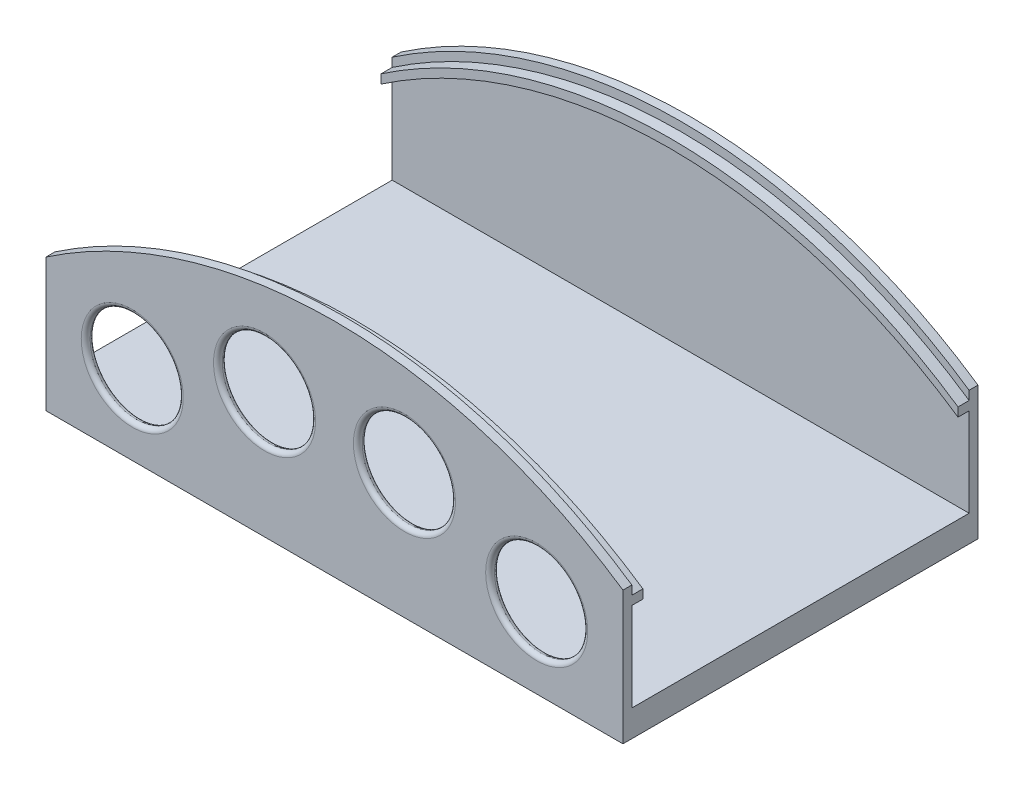
ISO-10303-21;
HEADER;
FILE_DESCRIPTION(('STEP AP214'),'2;1');
FILE_NAME('part.step','',(''),(''),'','','');
FILE_SCHEMA(('AUTOMOTIVE_DESIGN { 1 0 10303 214 1 1 1 1 }'));
ENDSEC;
DATA;
#1=APPLICATION_CONTEXT('core data for automotive mechanical design processes');
#2=APPLICATION_PROTOCOL_DEFINITION('international standard','automotive_design',2000,#1);
#3=PRODUCT_CONTEXT('',#1,'mechanical');
#4=PRODUCT('Part','Part','',(#3));
#5=PRODUCT_RELATED_PRODUCT_CATEGORY('part','',(#4));
#6=PRODUCT_DEFINITION_FORMATION('','',#4);
#7=PRODUCT_DEFINITION_CONTEXT('part definition',#1,'design');
#8=PRODUCT_DEFINITION('design','',#6,#7);
#9=PRODUCT_DEFINITION_SHAPE('','',#8);
#10=(LENGTH_UNIT() NAMED_UNIT(*) SI_UNIT(.MILLI.,.METRE.));
#11=(NAMED_UNIT(*) PLANE_ANGLE_UNIT() SI_UNIT($,.RADIAN.));
#12=(NAMED_UNIT(*) SI_UNIT($,.STERADIAN.) SOLID_ANGLE_UNIT());
#13=UNCERTAINTY_MEASURE_WITH_UNIT(LENGTH_MEASURE(1.E-05),#10,'distance_accuracy_value','');
#14=(GEOMETRIC_REPRESENTATION_CONTEXT(3) GLOBAL_UNCERTAINTY_ASSIGNED_CONTEXT((#13)) GLOBAL_UNIT_ASSIGNED_CONTEXT((#10,
#11,#12)) REPRESENTATION_CONTEXT('',''));
#15=CARTESIAN_POINT('',(0.,0.,0.));
#16=DIRECTION('',(0.,0.,1.));
#17=DIRECTION('',(1.,0.,0.));
#18=AXIS2_PLACEMENT_3D('',#15,#16,#17);
#19=CARTESIAN_POINT('',(0.,6.,2.));
#20=DIRECTION('',(0.,0.,-1.));
#21=DIRECTION('',(-1.,0.,0.));
#22=AXIS2_PLACEMENT_3D('',#19,#20,#21);
#23=PLANE('',#22);
#24=CARTESIAN_POINT('',(65.,-67.6250000000005,2.));
#25=DIRECTION('',(0.,0.,1.));
#26=DIRECTION('',(-1.,0.,0.));
#27=AXIS2_PLACEMENT_3D('',#24,#25,#26);
#28=CIRCLE('',#27,115.625);
#29=CARTESIAN_POINT('',(130.,28.,2.));
#30=VERTEX_POINT('',#29);
#31=CARTESIAN_POINT('',(0.,28.,2.));
#32=VERTEX_POINT('',#31);
#33=EDGE_CURVE('E230',#30,#32,#28,.T.);
#34=ORIENTED_EDGE('',*,*,#33,.F.);
#35=DIRECTION('',(0.,1.,0.));
#36=VECTOR('',#35,1.);
#37=CARTESIAN_POINT('',(130.,6.,2.));
#38=LINE('',#37,#36);
#39=CARTESIAN_POINT('',(130.,30.,2.));
#40=VERTEX_POINT('',#39);
#41=EDGE_CURVE('E382',#30,#40,#38,.T.);
#42=ORIENTED_EDGE('',*,*,#41,.T.);
#43=CARTESIAN_POINT('',(65.,-65.625,2.));
#44=DIRECTION('',(0.,0.,-1.));
#45=DIRECTION('',(-1.,0.,0.));
#46=AXIS2_PLACEMENT_3D('',#43,#44,#45);
#47=CIRCLE('',#46,115.625);
#48=CARTESIAN_POINT('',(0.,30.,2.));
#49=VERTEX_POINT('',#48);
#50=EDGE_CURVE('E436',#49,#40,#47,.T.);
#51=ORIENTED_EDGE('',*,*,#50,.F.);
#52=DIRECTION('',(0.,1.,0.));
#53=VECTOR('',#52,1.);
#54=CARTESIAN_POINT('',(0.,6.,2.));
#55=LINE('',#54,#53);
#56=EDGE_CURVE('E65',#32,#49,#55,.T.);
#57=ORIENTED_EDGE('',*,*,#56,.F.);
#58=EDGE_LOOP('',(#34,#42,#51,#57));
#59=FACE_BOUND('',#58,.T.);
#60=ADVANCED_FACE('F39',(#59),#23,.F.);
#61=CARTESIAN_POINT('',(65.,-69.6250000000005,2.));
#62=DIRECTION('',(0.,0.,-1.));
#63=DIRECTION('',(-1.,0.,0.));
#64=AXIS2_PLACEMENT_3D('',#61,#62,#63);
#65=CIRCLE('',#64,115.625);
#66=CARTESIAN_POINT('',(0.,26.,2.));
#67=VERTEX_POINT('',#66);
#68=CARTESIAN_POINT('',(130.,26.,2.));
#69=VERTEX_POINT('',#68);
#70=EDGE_CURVE('E227',#67,#69,#65,.T.);
#71=ORIENTED_EDGE('',*,*,#70,.F.);
#72=CARTESIAN_POINT('',(0.,6.,2.));
#73=VERTEX_POINT('',#72);
#74=EDGE_CURVE('E370',#73,#67,#55,.T.);
#75=ORIENTED_EDGE('',*,*,#74,.F.);
#76=DIRECTION('',(1.,0.,0.));
#77=VECTOR('',#76,1.);
#78=CARTESIAN_POINT('',(0.,6.,2.));
#79=LINE('',#78,#77);
#80=CARTESIAN_POINT('',(130.,6.,2.));
#81=VERTEX_POINT('',#80);
#82=EDGE_CURVE('E385',#73,#81,#79,.T.);
#83=ORIENTED_EDGE('',*,*,#82,.T.);
#84=EDGE_CURVE('E57',#81,#69,#38,.T.);
#85=ORIENTED_EDGE('',*,*,#84,.T.);
#86=EDGE_LOOP('',(#71,#75,#83,#85));
#87=FACE_BOUND('',#86,.T.);
#88=ADVANCED_FACE('F502',(#87),#23,.F.);
#89=CARTESIAN_POINT('',(0.,6.,78.));
#90=DIRECTION('',(0.,0.,1.));
#91=DIRECTION('',(1.,0.,0.));
#92=AXIS2_PLACEMENT_3D('',#89,#90,#91);
#93=PLANE('',#92);
#94=CARTESIAN_POINT('',(65.,-67.6249999999999,78.));
#95=DIRECTION('',(0.,0.,-1.));
#96=DIRECTION('',(1.,0.,0.));
#97=AXIS2_PLACEMENT_3D('',#94,#95,#96);
#98=CIRCLE('',#97,115.625);
#99=CARTESIAN_POINT('',(0.,28.,78.));
#100=VERTEX_POINT('',#99);
#101=CARTESIAN_POINT('',(130.,28.,78.));
#102=VERTEX_POINT('',#101);
#103=EDGE_CURVE('E232',#100,#102,#98,.T.);
#104=ORIENTED_EDGE('',*,*,#103,.F.);
#105=DIRECTION('',(0.,-1.,0.));
#106=VECTOR('',#105,1.);
#107=CARTESIAN_POINT('',(0.,6.,78.));
#108=LINE('',#107,#106);
#109=CARTESIAN_POINT('',(0.,30.,78.));
#110=VERTEX_POINT('',#109);
#111=EDGE_CURVE('E361',#110,#100,#108,.T.);
#112=ORIENTED_EDGE('',*,*,#111,.F.);
#113=CARTESIAN_POINT('',(65.,-65.625,78.));
#114=DIRECTION('',(0.,0.,1.));
#115=DIRECTION('',(1.,0.,0.));
#116=AXIS2_PLACEMENT_3D('',#113,#114,#115);
#117=CIRCLE('',#116,115.625);
#118=CARTESIAN_POINT('',(130.,30.,78.));
#119=VERTEX_POINT('',#118);
#120=EDGE_CURVE('E440',#119,#110,#117,.T.);
#121=ORIENTED_EDGE('',*,*,#120,.F.);
#122=DIRECTION('',(0.,-1.,0.));
#123=VECTOR('',#122,1.);
#124=CARTESIAN_POINT('',(130.,6.,78.));
#125=LINE('',#124,#123);
#126=EDGE_CURVE('E374',#119,#102,#125,.T.);
#127=ORIENTED_EDGE('',*,*,#126,.T.);
#128=EDGE_LOOP('',(#104,#112,#121,#127));
#129=FACE_BOUND('',#128,.T.);
#130=ADVANCED_FACE('F507',(#129),#93,.F.);
#131=CARTESIAN_POINT('',(19.439269403951,18.,78.));
#132=DIRECTION('',(0.,0.,1.));
#133=DIRECTION('',(1.,0.,0.));
#134=AXIS2_PLACEMENT_3D('',#131,#132,#133);
#135=CIRCLE('',#134,11.5);
#136=CARTESIAN_POINT('',(30.939269403951,18.,78.));
#137=VERTEX_POINT('',#136);
#138=EDGE_CURVE('E460',#137,#137,#135,.T.);
#139=ORIENTED_EDGE('',*,*,#138,.T.);
#140=EDGE_LOOP('',(#139));
#141=FACE_BOUND('',#140,.T.);
#142=CARTESIAN_POINT('',(49.237283636687,28.292291114552,78.));
#143=DIRECTION('',(0.,0.,1.));
#144=DIRECTION('',(1.,0.,0.));
#145=AXIS2_PLACEMENT_3D('',#142,#143,#144);
#146=CIRCLE('',#145,11.5);
#147=CARTESIAN_POINT('',(60.737283636687,28.292291114552,78.));
#148=VERTEX_POINT('',#147);
#149=EDGE_CURVE('E464',#148,#148,#146,.T.);
#150=ORIENTED_EDGE('',*,*,#149,.T.);
#151=EDGE_LOOP('',(#150));
#152=FACE_BOUND('',#151,.T.);
#153=CARTESIAN_POINT('',(80.762716363313,28.292291114552,78.));
#154=DIRECTION('',(0.,0.,1.));
#155=DIRECTION('',(1.,0.,0.));
#156=AXIS2_PLACEMENT_3D('',#153,#154,#155);
#157=CIRCLE('',#156,11.5);
#158=CARTESIAN_POINT('',(92.262716363313,28.292291114552,78.));
#159=VERTEX_POINT('',#158);
#160=EDGE_CURVE('E49',#159,#159,#157,.T.);
#161=ORIENTED_EDGE('',*,*,#160,.T.);
#162=EDGE_LOOP('',(#161));
#163=FACE_BOUND('',#162,.T.);
#164=CARTESIAN_POINT('',(110.560730596049,18.,78.));
#165=DIRECTION('',(0.,0.,1.));
#166=DIRECTION('',(1.,0.,0.));
#167=AXIS2_PLACEMENT_3D('',#164,#165,#166);
#168=CIRCLE('',#167,11.5);
#169=CARTESIAN_POINT('',(122.060730596049,18.,78.));
#170=VERTEX_POINT('',#169);
#171=EDGE_CURVE('E11',#170,#170,#168,.T.);
#172=ORIENTED_EDGE('',*,*,#171,.T.);
#173=EDGE_LOOP('',(#172));
#174=FACE_BOUND('',#173,.T.);
#175=CARTESIAN_POINT('',(65.,-69.625,78.));
#176=DIRECTION('',(0.,0.,1.));
#177=DIRECTION('',(1.,0.,0.));
#178=AXIS2_PLACEMENT_3D('',#175,#176,#177);
#179=CIRCLE('',#178,115.625);
#180=CARTESIAN_POINT('',(130.,26.,78.));
#181=VERTEX_POINT('',#180);
#182=CARTESIAN_POINT('',(0.,26.,78.));
#183=VERTEX_POINT('',#182);
#184=EDGE_CURVE('E237',#181,#183,#179,.T.);
#185=ORIENTED_EDGE('',*,*,#184,.F.);
#186=CARTESIAN_POINT('',(130.,6.,78.));
#187=VERTEX_POINT('',#186);
#188=EDGE_CURVE('E307',#181,#187,#125,.T.);
#189=ORIENTED_EDGE('',*,*,#188,.T.);
#190=DIRECTION('',(1.,0.,0.));
#191=VECTOR('',#190,1.);
#192=CARTESIAN_POINT('',(0.,6.,78.));
#193=LINE('',#192,#191);
#194=CARTESIAN_POINT('',(0.,6.,78.));
#195=VERTEX_POINT('',#194);
#196=EDGE_CURVE('E373',#195,#187,#193,.T.);
#197=ORIENTED_EDGE('',*,*,#196,.F.);
#198=EDGE_CURVE('E366',#183,#195,#108,.T.);
#199=ORIENTED_EDGE('',*,*,#198,.F.);
#200=EDGE_LOOP('',(#185,#189,#197,#199));
#201=FACE_BOUND('',#200,.T.);
#202=ADVANCED_FACE('F519',(#141,#152,#163,#174,#201),#93,.F.);
#203=CARTESIAN_POINT('',(65.,-65.625,80.));
#204=DIRECTION('',(0.,0.,-1.));
#205=DIRECTION('',(-1.,0.,0.));
#206=AXIS2_PLACEMENT_3D('',#203,#204,#205);
#207=CYLINDRICAL_SURFACE('',#206,115.625);
#208=DIRECTION('',(0.,0.,-1.));
#209=VECTOR('',#208,1.);
#210=CARTESIAN_POINT('',(130.,30.,80.));
#211=LINE('',#210,#209);
#212=CARTESIAN_POINT('',(130.,30.,80.));
#213=VERTEX_POINT('',#212);
#214=EDGE_CURVE('E424',#213,#119,#211,.T.);
#215=ORIENTED_EDGE('',*,*,#214,.T.);
#216=ORIENTED_EDGE('',*,*,#120,.T.);
#217=DIRECTION('',(0.,0.,-1.));
#218=VECTOR('',#217,1.);
#219=CARTESIAN_POINT('',(0.,30.,80.));
#220=LINE('',#219,#218);
#221=CARTESIAN_POINT('',(0.,30.,80.));
#222=VERTEX_POINT('',#221);
#223=EDGE_CURVE('E420',#222,#110,#220,.T.);
#224=ORIENTED_EDGE('',*,*,#223,.F.);
#225=CARTESIAN_POINT('',(65.,-65.625,80.));
#226=DIRECTION('',(0.,0.,1.));
#227=DIRECTION('',(-1.,0.,0.));
#228=AXIS2_PLACEMENT_3D('',#225,#226,#227);
#229=CIRCLE('',#228,115.625);
#230=EDGE_CURVE('E403',#213,#222,#229,.T.);
#231=ORIENTED_EDGE('',*,*,#230,.F.);
#232=EDGE_LOOP('',(#215,#216,#224,#231));
#233=FACE_BOUND('',#232,.T.);
#234=ADVANCED_FACE('F533',(#233),#207,.T.);
#235=CARTESIAN_POINT('',(0.,0.,80.));
#236=DIRECTION('',(1.,0.,0.));
#237=DIRECTION('',(0.,0.,-1.));
#238=AXIS2_PLACEMENT_3D('',#235,#236,#237);
#239=PLANE('',#238);
#240=ORIENTED_EDGE('',*,*,#223,.T.);
#241=ORIENTED_EDGE('',*,*,#111,.T.);
#242=DIRECTION('',(0.,0.,1.));
#243=VECTOR('',#242,1.);
#244=CARTESIAN_POINT('',(0.,28.,75.5));
#245=LINE('',#244,#243);
#246=CARTESIAN_POINT('',(0.,28.,75.5));
#247=VERTEX_POINT('',#246);
#248=EDGE_CURVE('E255',#247,#100,#245,.T.);
#249=ORIENTED_EDGE('',*,*,#248,.F.);
#250=DIRECTION('',(0.,1.,0.));
#251=VECTOR('',#250,1.);
#252=CARTESIAN_POINT('',(0.,26.,75.5));
#253=LINE('',#252,#251);
#254=CARTESIAN_POINT('',(0.,26.,75.5));
#255=VERTEX_POINT('',#254);
#256=EDGE_CURVE('E253',#255,#247,#253,.T.);
#257=ORIENTED_EDGE('',*,*,#256,.F.);
#258=DIRECTION('',(0.,0.,1.));
#259=VECTOR('',#258,1.);
#260=CARTESIAN_POINT('',(0.,26.,75.5));
#261=LINE('',#260,#259);
#262=EDGE_CURVE('E262',#255,#183,#261,.T.);
#263=ORIENTED_EDGE('',*,*,#262,.T.);
#264=ORIENTED_EDGE('',*,*,#198,.T.);
#265=DIRECTION('',(0.,0.,-1.));
#266=VECTOR('',#265,1.);
#267=CARTESIAN_POINT('',(0.,6.,78.));
#268=LINE('',#267,#266);
#269=EDGE_CURVE('E365',#195,#73,#268,.T.);
#270=ORIENTED_EDGE('',*,*,#269,.T.);
#271=ORIENTED_EDGE('',*,*,#74,.T.);
#272=DIRECTION('',(0.,0.,-1.));
#273=VECTOR('',#272,1.);
#274=CARTESIAN_POINT('',(0.,26.,4.5));
#275=LINE('',#274,#273);
#276=CARTESIAN_POINT('',(0.,26.,4.5));
#277=VERTEX_POINT('',#276);
#278=EDGE_CURVE('E212',#277,#67,#275,.T.);
#279=ORIENTED_EDGE('',*,*,#278,.F.);
#280=DIRECTION('',(0.,-1.,0.));
#281=VECTOR('',#280,1.);
#282=CARTESIAN_POINT('',(0.,26.,4.5));
#283=LINE('',#282,#281);
#284=CARTESIAN_POINT('',(0.,28.,4.5));
#285=VERTEX_POINT('',#284);
#286=EDGE_CURVE('E203',#285,#277,#283,.T.);
#287=ORIENTED_EDGE('',*,*,#286,.F.);
#288=DIRECTION('',(0.,0.,-1.));
#289=VECTOR('',#288,1.);
#290=CARTESIAN_POINT('',(0.,28.,4.5));
#291=LINE('',#290,#289);
#292=EDGE_CURVE('E208',#285,#32,#291,.T.);
#293=ORIENTED_EDGE('',*,*,#292,.T.);
#294=ORIENTED_EDGE('',*,*,#56,.T.);
#295=CARTESIAN_POINT('',(0.,30.,0.));
#296=VERTEX_POINT('',#295);
#297=EDGE_CURVE('E406',#49,#296,#220,.T.);
#298=ORIENTED_EDGE('',*,*,#297,.T.);
#299=DIRECTION('',(0.,-1.,0.));
#300=VECTOR('',#299,1.);
#301=CARTESIAN_POINT('',(0.,0.,0.));
#302=LINE('',#301,#300);
#303=CARTESIAN_POINT('',(0.,0.,0.));
#304=VERTEX_POINT('',#303);
#305=EDGE_CURVE('E388',#296,#304,#302,.T.);
#306=ORIENTED_EDGE('',*,*,#305,.T.);
#307=DIRECTION('',(0.,0.,-1.));
#308=VECTOR('',#307,1.);
#309=CARTESIAN_POINT('',(0.,0.,80.));
#310=LINE('',#309,#308);
#311=CARTESIAN_POINT('',(0.,0.,80.));
#312=VERTEX_POINT('',#311);
#313=EDGE_CURVE('E432',#312,#304,#310,.T.);
#314=ORIENTED_EDGE('',*,*,#313,.F.);
#315=DIRECTION('',(0.,-1.,0.));
#316=VECTOR('',#315,1.);
#317=CARTESIAN_POINT('',(0.,0.,80.));
#318=LINE('',#317,#316);
#319=EDGE_CURVE('E392',#222,#312,#318,.T.);
#320=ORIENTED_EDGE('',*,*,#319,.F.);
#321=EDGE_LOOP('',(#240,#241,#249,#257,#263,#264,#270,#271,#279,#287,#293,#294,#298,#306,#314,#320));
#322=FACE_BOUND('',#321,.T.);
#323=ADVANCED_FACE('F206',(#322),#239,.F.);
#324=CARTESIAN_POINT('',(0.,0.,80.));
#325=DIRECTION('',(0.,1.,0.));
#326=DIRECTION('',(0.,0.,1.));
#327=AXIS2_PLACEMENT_3D('',#324,#325,#326);
#328=PLANE('',#327);
#329=DIRECTION('',(1.,0.,0.));
#330=VECTOR('',#329,1.);
#331=CARTESIAN_POINT('',(15.,0.,14.));
#332=LINE('',#331,#330);
#333=CARTESIAN_POINT('',(15.,0.,14.));
#334=VERTEX_POINT('',#333);
#335=CARTESIAN_POINT('',(22.,0.,14.));
#336=VERTEX_POINT('',#335);
#337=EDGE_CURVE('E292',#334,#336,#332,.T.);
#338=ORIENTED_EDGE('',*,*,#337,.F.);
#339=DIRECTION('',(0.,0.,-1.));
#340=VECTOR('',#339,1.);
#341=CARTESIAN_POINT('',(15.,0.,66.));
#342=LINE('',#341,#340);
#343=CARTESIAN_POINT('',(15.,0.,66.));
#344=VERTEX_POINT('',#343);
#345=EDGE_CURVE('E289',#344,#334,#342,.T.);
#346=ORIENTED_EDGE('',*,*,#345,.F.);
#347=DIRECTION('',(-1.,0.,0.));
#348=VECTOR('',#347,1.);
#349=CARTESIAN_POINT('',(15.,0.,66.));
#350=LINE('',#349,#348);
#351=CARTESIAN_POINT('',(22.,0.,66.));
#352=VERTEX_POINT('',#351);
#353=EDGE_CURVE('E276',#352,#344,#350,.T.);
#354=ORIENTED_EDGE('',*,*,#353,.F.);
#355=DIRECTION('',(0.,0.,1.));
#356=VECTOR('',#355,1.);
#357=CARTESIAN_POINT('',(22.,0.,66.));
#358=LINE('',#357,#356);
#359=EDGE_CURVE('E297',#336,#352,#358,.T.);
#360=ORIENTED_EDGE('',*,*,#359,.F.);
#361=EDGE_LOOP('',(#338,#346,#354,#360));
#362=FACE_BOUND('',#361,.T.);
#363=DIRECTION('',(1.,0.,0.));
#364=VECTOR('',#363,1.);
#365=CARTESIAN_POINT('',(108.,0.,14.));
#366=LINE('',#365,#364);
#367=CARTESIAN_POINT('',(108.,0.,14.));
#368=VERTEX_POINT('',#367);
#369=CARTESIAN_POINT('',(115.,0.,14.));
#370=VERTEX_POINT('',#369);
#371=EDGE_CURVE('E338',#368,#370,#366,.T.);
#372=ORIENTED_EDGE('',*,*,#371,.F.);
#373=DIRECTION('',(0.,0.,-1.));
#374=VECTOR('',#373,1.);
#375=CARTESIAN_POINT('',(108.,0.,66.));
#376=LINE('',#375,#374);
#377=CARTESIAN_POINT('',(108.,0.,66.));
#378=VERTEX_POINT('',#377);
#379=EDGE_CURVE('E335',#378,#368,#376,.T.);
#380=ORIENTED_EDGE('',*,*,#379,.F.);
#381=DIRECTION('',(-1.,0.,0.));
#382=VECTOR('',#381,1.);
#383=CARTESIAN_POINT('',(108.,0.,66.));
#384=LINE('',#383,#382);
#385=CARTESIAN_POINT('',(115.,0.,66.));
#386=VERTEX_POINT('',#385);
#387=EDGE_CURVE('E322',#386,#378,#384,.T.);
#388=ORIENTED_EDGE('',*,*,#387,.F.);
#389=DIRECTION('',(0.,0.,1.));
#390=VECTOR('',#389,1.);
#391=CARTESIAN_POINT('',(115.,0.,66.));
#392=LINE('',#391,#390);
#393=EDGE_CURVE('E343',#370,#386,#392,.T.);
#394=ORIENTED_EDGE('',*,*,#393,.F.);
#395=EDGE_LOOP('',(#372,#380,#388,#394));
#396=FACE_BOUND('',#395,.T.);
#397=DIRECTION('',(1.,0.,0.));
#398=VECTOR('',#397,1.);
#399=CARTESIAN_POINT('',(0.,0.,0.));
#400=LINE('',#399,#398);
#401=CARTESIAN_POINT('',(130.,0.,0.));
#402=VERTEX_POINT('',#401);
#403=EDGE_CURVE('E410',#304,#402,#400,.T.);
#404=ORIENTED_EDGE('',*,*,#403,.T.);
#405=DIRECTION('',(0.,0.,-1.));
#406=VECTOR('',#405,1.);
#407=CARTESIAN_POINT('',(130.,0.,80.));
#408=LINE('',#407,#406);
#409=CARTESIAN_POINT('',(130.,0.,80.));
#410=VERTEX_POINT('',#409);
#411=EDGE_CURVE('E428',#410,#402,#408,.T.);
#412=ORIENTED_EDGE('',*,*,#411,.F.);
#413=DIRECTION('',(1.,0.,0.));
#414=VECTOR('',#413,1.);
#415=CARTESIAN_POINT('',(0.,0.,80.));
#416=LINE('',#415,#414);
#417=EDGE_CURVE('E396',#312,#410,#416,.T.);
#418=ORIENTED_EDGE('',*,*,#417,.F.);
#419=ORIENTED_EDGE('',*,*,#313,.T.);
#420=EDGE_LOOP('',(#404,#412,#418,#419));
#421=FACE_BOUND('',#420,.T.);
#422=ADVANCED_FACE('F536',(#362,#396,#421),#328,.F.);
#423=CARTESIAN_POINT('',(130.,0.,80.));
#424=DIRECTION('',(-1.,0.,0.));
#425=DIRECTION('',(0.,0.,1.));
#426=AXIS2_PLACEMENT_3D('',#423,#424,#425);
#427=PLANE('',#426);
#428=DIRECTION('',(0.,0.,-1.));
#429=VECTOR('',#428,1.);
#430=CARTESIAN_POINT('',(130.,6.,78.));
#431=LINE('',#430,#429);
#432=EDGE_CURVE('E378',#187,#81,#431,.T.);
#433=ORIENTED_EDGE('',*,*,#432,.F.);
#434=ORIENTED_EDGE('',*,*,#188,.F.);
#435=DIRECTION('',(0.,0.,1.));
#436=VECTOR('',#435,1.);
#437=CARTESIAN_POINT('',(130.,26.,75.5));
#438=LINE('',#437,#436);
#439=CARTESIAN_POINT('',(130.,26.,75.5));
#440=VERTEX_POINT('',#439);
#441=EDGE_CURVE('E265',#440,#181,#438,.T.);
#442=ORIENTED_EDGE('',*,*,#441,.F.);
#443=DIRECTION('',(0.,-1.,0.));
#444=VECTOR('',#443,1.);
#445=CARTESIAN_POINT('',(130.,26.,75.5));
#446=LINE('',#445,#444);
#447=CARTESIAN_POINT('',(130.,28.,75.5));
#448=VERTEX_POINT('',#447);
#449=EDGE_CURVE('E247',#448,#440,#446,.T.);
#450=ORIENTED_EDGE('',*,*,#449,.F.);
#451=DIRECTION('',(0.,0.,1.));
#452=VECTOR('',#451,1.);
#453=CARTESIAN_POINT('',(130.,28.,75.5));
#454=LINE('',#453,#452);
#455=EDGE_CURVE('E268',#448,#102,#454,.T.);
#456=ORIENTED_EDGE('',*,*,#455,.T.);
#457=ORIENTED_EDGE('',*,*,#126,.F.);
#458=ORIENTED_EDGE('',*,*,#214,.F.);
#459=DIRECTION('',(0.,1.,0.));
#460=VECTOR('',#459,1.);
#461=CARTESIAN_POINT('',(130.,0.,80.));
#462=LINE('',#461,#460);
#463=EDGE_CURVE('E400',#410,#213,#462,.T.);
#464=ORIENTED_EDGE('',*,*,#463,.F.);
#465=ORIENTED_EDGE('',*,*,#411,.T.);
#466=DIRECTION('',(0.,1.,0.));
#467=VECTOR('',#466,1.);
#468=CARTESIAN_POINT('',(130.,0.,0.));
#469=LINE('',#468,#467);
#470=CARTESIAN_POINT('',(130.,30.,0.));
#471=VERTEX_POINT('',#470);
#472=EDGE_CURVE('E413',#402,#471,#469,.T.);
#473=ORIENTED_EDGE('',*,*,#472,.T.);
#474=EDGE_CURVE('E423',#40,#471,#211,.T.);
#475=ORIENTED_EDGE('',*,*,#474,.F.);
#476=ORIENTED_EDGE('',*,*,#41,.F.);
#477=DIRECTION('',(0.,0.,-1.));
#478=VECTOR('',#477,1.);
#479=CARTESIAN_POINT('',(130.,28.,4.5));
#480=LINE('',#479,#478);
#481=CARTESIAN_POINT('',(130.,28.,4.5));
#482=VERTEX_POINT('',#481);
#483=EDGE_CURVE('E598',#482,#30,#480,.T.);
#484=ORIENTED_EDGE('',*,*,#483,.F.);
#485=DIRECTION('',(0.,1.,0.));
#486=VECTOR('',#485,1.);
#487=CARTESIAN_POINT('',(130.,26.,4.5));
#488=LINE('',#487,#486);
#489=CARTESIAN_POINT('',(130.,26.,4.5));
#490=VERTEX_POINT('',#489);
#491=EDGE_CURVE('E222',#490,#482,#488,.T.);
#492=ORIENTED_EDGE('',*,*,#491,.F.);
#493=DIRECTION('',(0.,0.,-1.));
#494=VECTOR('',#493,1.);
#495=CARTESIAN_POINT('',(130.,26.,4.5));
#496=LINE('',#495,#494);
#497=EDGE_CURVE('E239',#490,#69,#496,.T.);
#498=ORIENTED_EDGE('',*,*,#497,.T.);
#499=ORIENTED_EDGE('',*,*,#84,.F.);
#500=EDGE_LOOP('',(#433,#434,#442,#450,#456,#457,#458,#464,#465,#473,#475,#476,#484,#492,#498,#499));
#501=FACE_BOUND('',#500,.T.);
#502=ADVANCED_FACE('F531',(#501),#427,.F.);
#503=ORIENTED_EDGE('',*,*,#297,.F.);
#504=ORIENTED_EDGE('',*,*,#50,.T.);
#505=ORIENTED_EDGE('',*,*,#474,.T.);
#506=CARTESIAN_POINT('',(65.,-65.625,0.));
#507=DIRECTION('',(0.,0.,1.));
#508=DIRECTION('',(-1.,0.,0.));
#509=AXIS2_PLACEMENT_3D('',#506,#507,#508);
#510=CIRCLE('',#509,115.625);
#511=EDGE_CURVE('E397',#471,#296,#510,.T.);
#512=ORIENTED_EDGE('',*,*,#511,.T.);
#513=EDGE_LOOP('',(#503,#504,#505,#512));
#514=FACE_BOUND('',#513,.T.);
#515=ADVANCED_FACE('F524',(#514),#207,.T.);
#516=CARTESIAN_POINT('',(65.,-65.625,80.));
#517=DIRECTION('',(0.,0.,-1.));
#518=DIRECTION('',(-1.,0.,0.));
#519=AXIS2_PLACEMENT_3D('',#516,#517,#518);
#520=PLANE('',#519);
#521=CARTESIAN_POINT('',(110.560730596049,18.,80.));
#522=DIRECTION('',(0.,0.,-1.));
#523=DIRECTION('',(-1.,0.,0.));
#524=AXIS2_PLACEMENT_3D('',#521,#522,#523);
#525=CIRCLE('',#524,11.5);
#526=CARTESIAN_POINT('',(99.060730596049,18.,80.));
#527=VERTEX_POINT('',#526);
#528=EDGE_CURVE('E456',#527,#527,#525,.T.);
#529=ORIENTED_EDGE('',*,*,#528,.T.);
#530=EDGE_LOOP('',(#529));
#531=FACE_BOUND('',#530,.T.);
#532=CARTESIAN_POINT('',(80.762716363313,28.292291114552,80.));
#533=DIRECTION('',(0.,0.,-1.));
#534=DIRECTION('',(-1.,0.,0.));
#535=AXIS2_PLACEMENT_3D('',#532,#533,#534);
#536=CIRCLE('',#535,11.5);
#537=CARTESIAN_POINT('',(69.262716363313,28.292291114552,80.));
#538=VERTEX_POINT('',#537);
#539=EDGE_CURVE('E452',#538,#538,#536,.T.);
#540=ORIENTED_EDGE('',*,*,#539,.T.);
#541=EDGE_LOOP('',(#540));
#542=FACE_BOUND('',#541,.T.);
#543=CARTESIAN_POINT('',(49.237283636687,28.292291114552,80.));
#544=DIRECTION('',(0.,0.,-1.));
#545=DIRECTION('',(-1.,0.,0.));
#546=AXIS2_PLACEMENT_3D('',#543,#544,#545);
#547=CIRCLE('',#546,11.5);
#548=CARTESIAN_POINT('',(37.737283636687,28.292291114552,80.));
#549=VERTEX_POINT('',#548);
#550=EDGE_CURVE('E448',#549,#549,#547,.T.);
#551=ORIENTED_EDGE('',*,*,#550,.T.);
#552=EDGE_LOOP('',(#551));
#553=FACE_BOUND('',#552,.T.);
#554=CARTESIAN_POINT('',(19.439269403951,18.,80.));
#555=DIRECTION('',(0.,0.,-1.));
#556=DIRECTION('',(-1.,0.,0.));
#557=AXIS2_PLACEMENT_3D('',#554,#555,#556);
#558=CIRCLE('',#557,11.5);
#559=CARTESIAN_POINT('',(7.93926940395098,18.,80.));
#560=VERTEX_POINT('',#559);
#561=EDGE_CURVE('E444',#560,#560,#558,.T.);
#562=ORIENTED_EDGE('',*,*,#561,.T.);
#563=EDGE_LOOP('',(#562));
#564=FACE_BOUND('',#563,.T.);
#565=ORIENTED_EDGE('',*,*,#319,.T.);
#566=ORIENTED_EDGE('',*,*,#417,.T.);
#567=ORIENTED_EDGE('',*,*,#463,.T.);
#568=ORIENTED_EDGE('',*,*,#230,.T.);
#569=EDGE_LOOP('',(#565,#566,#567,#568));
#570=FACE_BOUND('',#569,.T.);
#571=ADVANCED_FACE('F521',(#531,#542,#553,#564,#570),#520,.F.);
#572=CARTESIAN_POINT('',(65.,-65.625,0.));
#573=DIRECTION('',(0.,0.,-1.));
#574=DIRECTION('',(-1.,0.,0.));
#575=AXIS2_PLACEMENT_3D('',#572,#573,#574);
#576=PLANE('',#575);
#577=ORIENTED_EDGE('',*,*,#305,.F.);
#578=ORIENTED_EDGE('',*,*,#511,.F.);
#579=ORIENTED_EDGE('',*,*,#472,.F.);
#580=ORIENTED_EDGE('',*,*,#403,.F.);
#581=EDGE_LOOP('',(#577,#578,#579,#580));
#582=FACE_BOUND('',#581,.T.);
#583=ADVANCED_FACE('F515',(#582),#576,.T.);
#584=CARTESIAN_POINT('',(0.,6.,78.));
#585=DIRECTION('',(0.,-1.,0.));
#586=DIRECTION('',(0.,0.,-1.));
#587=AXIS2_PLACEMENT_3D('',#584,#585,#586);
#588=PLANE('',#587);
#589=ORIENTED_EDGE('',*,*,#432,.T.);
#590=ORIENTED_EDGE('',*,*,#82,.F.);
#591=ORIENTED_EDGE('',*,*,#269,.F.);
#592=ORIENTED_EDGE('',*,*,#196,.T.);
#593=EDGE_LOOP('',(#589,#590,#591,#592));
#594=FACE_BOUND('',#593,.T.);
#595=ADVANCED_FACE('F512',(#594),#588,.F.);
#596=CARTESIAN_POINT('',(108.,3.2,66.));
#597=DIRECTION('',(-1.,0.,0.));
#598=DIRECTION('',(0.,0.,1.));
#599=AXIS2_PLACEMENT_3D('',#596,#597,#598);
#600=PLANE('',#599);
#601=ORIENTED_EDGE('',*,*,#379,.T.);
#602=DIRECTION('',(0.,-1.,0.));
#603=VECTOR('',#602,1.);
#604=CARTESIAN_POINT('',(108.,3.2,14.));
#605=LINE('',#604,#603);
#606=CARTESIAN_POINT('',(108.,3.2,14.));
#607=VERTEX_POINT('',#606);
#608=EDGE_CURVE('E334',#607,#368,#605,.T.);
#609=ORIENTED_EDGE('',*,*,#608,.F.);
#610=DIRECTION('',(0.,0.,-1.));
#611=VECTOR('',#610,1.);
#612=CARTESIAN_POINT('',(108.,3.2,66.));
#613=LINE('',#612,#611);
#614=CARTESIAN_POINT('',(108.,3.2,66.));
#615=VERTEX_POINT('',#614);
#616=EDGE_CURVE('E317',#615,#607,#613,.T.);
#617=ORIENTED_EDGE('',*,*,#616,.F.);
#618=DIRECTION('',(0.,-1.,0.));
#619=VECTOR('',#618,1.);
#620=CARTESIAN_POINT('',(108.,3.2,66.));
#621=LINE('',#620,#619);
#622=EDGE_CURVE('E293',#615,#378,#621,.T.);
#623=ORIENTED_EDGE('',*,*,#622,.T.);
#624=EDGE_LOOP('',(#601,#609,#617,#623));
#625=FACE_BOUND('',#624,.T.);
#626=ADVANCED_FACE('F510',(#625),#600,.F.);
#627=CARTESIAN_POINT('',(108.,3.2,66.));
#628=DIRECTION('',(0.,0.,1.));
#629=DIRECTION('',(1.,0.,0.));
#630=AXIS2_PLACEMENT_3D('',#627,#628,#629);
#631=PLANE('',#630);
#632=ORIENTED_EDGE('',*,*,#387,.T.);
#633=ORIENTED_EDGE('',*,*,#622,.F.);
#634=DIRECTION('',(-1.,0.,0.));
#635=VECTOR('',#634,1.);
#636=CARTESIAN_POINT('',(108.,3.2,66.));
#637=LINE('',#636,#635);
#638=CARTESIAN_POINT('',(115.,3.2,66.));
#639=VERTEX_POINT('',#638);
#640=EDGE_CURVE('E330',#639,#615,#637,.T.);
#641=ORIENTED_EDGE('',*,*,#640,.F.);
#642=DIRECTION('',(0.,-1.,0.));
#643=VECTOR('',#642,1.);
#644=CARTESIAN_POINT('',(115.,3.2,66.));
#645=LINE('',#644,#643);
#646=EDGE_CURVE('E352',#639,#386,#645,.T.);
#647=ORIENTED_EDGE('',*,*,#646,.T.);
#648=EDGE_LOOP('',(#632,#633,#641,#647));
#649=FACE_BOUND('',#648,.T.);
#650=ADVANCED_FACE('F675',(#649),#631,.F.);
#651=CARTESIAN_POINT('',(115.,3.2,66.));
#652=DIRECTION('',(1.,0.,0.));
#653=DIRECTION('',(0.,0.,-1.));
#654=AXIS2_PLACEMENT_3D('',#651,#652,#653);
#655=PLANE('',#654);
#656=ORIENTED_EDGE('',*,*,#393,.T.);
#657=ORIENTED_EDGE('',*,*,#646,.F.);
#658=DIRECTION('',(0.,0.,1.));
#659=VECTOR('',#658,1.);
#660=CARTESIAN_POINT('',(115.,3.2,66.));
#661=LINE('',#660,#659);
#662=CARTESIAN_POINT('',(115.,3.2,14.));
#663=VERTEX_POINT('',#662);
#664=EDGE_CURVE('E326',#663,#639,#661,.T.);
#665=ORIENTED_EDGE('',*,*,#664,.F.);
#666=DIRECTION('',(0.,-1.,0.));
#667=VECTOR('',#666,1.);
#668=CARTESIAN_POINT('',(115.,3.2,14.));
#669=LINE('',#668,#667);
#670=EDGE_CURVE('E355',#663,#370,#669,.T.);
#671=ORIENTED_EDGE('',*,*,#670,.T.);
#672=EDGE_LOOP('',(#656,#657,#665,#671));
#673=FACE_BOUND('',#672,.T.);
#674=ADVANCED_FACE('F682',(#673),#655,.F.);
#675=CARTESIAN_POINT('',(108.,3.2,14.));
#676=DIRECTION('',(0.,0.,-1.));
#677=DIRECTION('',(-1.,0.,0.));
#678=AXIS2_PLACEMENT_3D('',#675,#676,#677);
#679=PLANE('',#678);
#680=ORIENTED_EDGE('',*,*,#371,.T.);
#681=ORIENTED_EDGE('',*,*,#670,.F.);
#682=DIRECTION('',(1.,0.,0.));
#683=VECTOR('',#682,1.);
#684=CARTESIAN_POINT('',(108.,3.2,14.));
#685=LINE('',#684,#683);
#686=EDGE_CURVE('E321',#607,#663,#685,.T.);
#687=ORIENTED_EDGE('',*,*,#686,.F.);
#688=ORIENTED_EDGE('',*,*,#608,.T.);
#689=EDGE_LOOP('',(#680,#681,#687,#688));
#690=FACE_BOUND('',#689,.T.);
#691=ADVANCED_FACE('F690',(#690),#679,.F.);
#692=CARTESIAN_POINT('',(0.,3.2,0.));
#693=DIRECTION('',(0.,-1.,0.));
#694=DIRECTION('',(0.,0.,-1.));
#695=AXIS2_PLACEMENT_3D('',#692,#693,#694);
#696=PLANE('',#695);
#697=ORIENTED_EDGE('',*,*,#616,.T.);
#698=ORIENTED_EDGE('',*,*,#686,.T.);
#699=ORIENTED_EDGE('',*,*,#664,.T.);
#700=ORIENTED_EDGE('',*,*,#640,.T.);
#701=EDGE_LOOP('',(#697,#698,#699,#700));
#702=FACE_BOUND('',#701,.T.);
#703=ADVANCED_FACE('F698',(#702),#696,.T.);
#704=CARTESIAN_POINT('',(15.,3.2,66.));
#705=DIRECTION('',(-1.,0.,0.));
#706=DIRECTION('',(0.,0.,1.));
#707=AXIS2_PLACEMENT_3D('',#704,#705,#706);
#708=PLANE('',#707);
#709=ORIENTED_EDGE('',*,*,#345,.T.);
#710=DIRECTION('',(0.,-1.,0.));
#711=VECTOR('',#710,1.);
#712=CARTESIAN_POINT('',(15.,3.2,14.));
#713=LINE('',#712,#711);
#714=CARTESIAN_POINT('',(15.,3.2,14.));
#715=VERTEX_POINT('',#714);
#716=EDGE_CURVE('E288',#715,#334,#713,.T.);
#717=ORIENTED_EDGE('',*,*,#716,.F.);
#718=DIRECTION('',(0.,0.,-1.));
#719=VECTOR('',#718,1.);
#720=CARTESIAN_POINT('',(15.,3.2,66.));
#721=LINE('',#720,#719);
#722=CARTESIAN_POINT('',(15.,3.2,66.));
#723=VERTEX_POINT('',#722);
#724=EDGE_CURVE('E271',#723,#715,#721,.T.);
#725=ORIENTED_EDGE('',*,*,#724,.F.);
#726=DIRECTION('',(0.,-1.,0.));
#727=VECTOR('',#726,1.);
#728=CARTESIAN_POINT('',(15.,3.2,66.));
#729=LINE('',#728,#727);
#730=EDGE_CURVE('E304',#723,#344,#729,.T.);
#731=ORIENTED_EDGE('',*,*,#730,.T.);
#732=EDGE_LOOP('',(#709,#717,#725,#731));
#733=FACE_BOUND('',#732,.T.);
#734=ADVANCED_FACE('F705',(#733),#708,.F.);
#735=CARTESIAN_POINT('',(15.,3.2,66.));
#736=DIRECTION('',(0.,0.,1.));
#737=DIRECTION('',(1.,0.,0.));
#738=AXIS2_PLACEMENT_3D('',#735,#736,#737);
#739=PLANE('',#738);
#740=ORIENTED_EDGE('',*,*,#353,.T.);
#741=ORIENTED_EDGE('',*,*,#730,.F.);
#742=DIRECTION('',(-1.,0.,0.));
#743=VECTOR('',#742,1.);
#744=CARTESIAN_POINT('',(15.,3.2,66.));
#745=LINE('',#744,#743);
#746=CARTESIAN_POINT('',(22.,3.2,66.));
#747=VERTEX_POINT('',#746);
#748=EDGE_CURVE('E284',#747,#723,#745,.T.);
#749=ORIENTED_EDGE('',*,*,#748,.F.);
#750=DIRECTION('',(0.,-1.,0.));
#751=VECTOR('',#750,1.);
#752=CARTESIAN_POINT('',(22.,3.2,66.));
#753=LINE('',#752,#751);
#754=EDGE_CURVE('E308',#747,#352,#753,.T.);
#755=ORIENTED_EDGE('',*,*,#754,.T.);
#756=EDGE_LOOP('',(#740,#741,#749,#755));
#757=FACE_BOUND('',#756,.T.);
#758=ADVANCED_FACE('F713',(#757),#739,.F.);
#759=CARTESIAN_POINT('',(22.,3.2,66.));
#760=DIRECTION('',(1.,0.,0.));
#761=DIRECTION('',(0.,0.,-1.));
#762=AXIS2_PLACEMENT_3D('',#759,#760,#761);
#763=PLANE('',#762);
#764=ORIENTED_EDGE('',*,*,#359,.T.);
#765=ORIENTED_EDGE('',*,*,#754,.F.);
#766=DIRECTION('',(0.,0.,1.));
#767=VECTOR('',#766,1.);
#768=CARTESIAN_POINT('',(22.,3.2,66.));
#769=LINE('',#768,#767);
#770=CARTESIAN_POINT('',(22.,3.2,14.));
#771=VERTEX_POINT('',#770);
#772=EDGE_CURVE('E280',#771,#747,#769,.T.);
#773=ORIENTED_EDGE('',*,*,#772,.F.);
#774=DIRECTION('',(0.,-1.,0.));
#775=VECTOR('',#774,1.);
#776=CARTESIAN_POINT('',(22.,3.2,14.));
#777=LINE('',#776,#775);
#778=EDGE_CURVE('E311',#771,#336,#777,.T.);
#779=ORIENTED_EDGE('',*,*,#778,.T.);
#780=EDGE_LOOP('',(#764,#765,#773,#779));
#781=FACE_BOUND('',#780,.T.);
#782=ADVANCED_FACE('F721',(#781),#763,.F.);
#783=CARTESIAN_POINT('',(15.,3.2,14.));
#784=DIRECTION('',(0.,0.,-1.));
#785=DIRECTION('',(-1.,0.,0.));
#786=AXIS2_PLACEMENT_3D('',#783,#784,#785);
#787=PLANE('',#786);
#788=ORIENTED_EDGE('',*,*,#337,.T.);
#789=ORIENTED_EDGE('',*,*,#778,.F.);
#790=DIRECTION('',(1.,0.,0.));
#791=VECTOR('',#790,1.);
#792=CARTESIAN_POINT('',(15.,3.2,14.));
#793=LINE('',#792,#791);
#794=EDGE_CURVE('E275',#715,#771,#793,.T.);
#795=ORIENTED_EDGE('',*,*,#794,.F.);
#796=ORIENTED_EDGE('',*,*,#716,.T.);
#797=EDGE_LOOP('',(#788,#789,#795,#796));
#798=FACE_BOUND('',#797,.T.);
#799=ADVANCED_FACE('F729',(#798),#787,.F.);
#800=CARTESIAN_POINT('',(0.,3.2,0.));
#801=DIRECTION('',(0.,-1.,0.));
#802=DIRECTION('',(0.,0.,-1.));
#803=AXIS2_PLACEMENT_3D('',#800,#801,#802);
#804=PLANE('',#803);
#805=ORIENTED_EDGE('',*,*,#724,.T.);
#806=ORIENTED_EDGE('',*,*,#794,.T.);
#807=ORIENTED_EDGE('',*,*,#772,.T.);
#808=ORIENTED_EDGE('',*,*,#748,.T.);
#809=EDGE_LOOP('',(#805,#806,#807,#808));
#810=FACE_BOUND('',#809,.T.);
#811=ADVANCED_FACE('F551',(#810),#804,.T.);
#812=CARTESIAN_POINT('',(110.560730596049,18.,79.));
#813=DIRECTION('',(0.,0.,1.));
#814=DIRECTION('',(1.,0.,0.));
#815=AXIS2_PLACEMENT_3D('',#812,#813,#814);
#816=TOROIDAL_SURFACE('',#815,11.5,1.);
#817=ORIENTED_EDGE('',*,*,#171,.F.);
#818=EDGE_LOOP('',(#817));
#819=FACE_BOUND('',#818,.T.);
#820=CARTESIAN_POINT('',(110.560730596049,18.,79.));
#821=DIRECTION('',(0.,0.,1.));
#822=DIRECTION('',(1.,0.,0.));
#823=AXIS2_PLACEMENT_3D('',#820,#821,#822);
#824=CIRCLE('',#823,10.5);
#825=CARTESIAN_POINT('',(121.060730596049,18.,79.));
#826=VERTEX_POINT('',#825);
#827=EDGE_CURVE('E339',#826,#826,#824,.F.);
#828=ORIENTED_EDGE('',*,*,#827,.F.);
#829=EDGE_LOOP('',(#828));
#830=FACE_BOUND('',#829,.T.);
#831=ADVANCED_FACE('F547',(#819,#830),#816,.T.);
#832=CARTESIAN_POINT('',(110.560730596049,18.,79.));
#833=DIRECTION('',(0.,0.,-1.));
#834=DIRECTION('',(-1.,0.,0.));
#835=AXIS2_PLACEMENT_3D('',#832,#833,#834);
#836=TOROIDAL_SURFACE('',#835,11.5,1.);
#837=ORIENTED_EDGE('',*,*,#528,.F.);
#838=EDGE_LOOP('',(#837));
#839=FACE_BOUND('',#838,.T.);
#840=ORIENTED_EDGE('',*,*,#827,.T.);
#841=EDGE_LOOP('',(#840));
#842=FACE_BOUND('',#841,.T.);
#843=ADVANCED_FACE('F543',(#839,#842),#836,.T.);
#844=CARTESIAN_POINT('',(80.762716363313,28.292291114552,79.));
#845=DIRECTION('',(0.,0.,1.));
#846=DIRECTION('',(1.,0.,0.));
#847=AXIS2_PLACEMENT_3D('',#844,#845,#846);
#848=TOROIDAL_SURFACE('',#847,11.5,1.);
#849=ORIENTED_EDGE('',*,*,#160,.F.);
#850=EDGE_LOOP('',(#849));
#851=FACE_BOUND('',#850,.T.);
#852=CARTESIAN_POINT('',(80.762716363313,28.292291114552,79.));
#853=DIRECTION('',(0.,0.,1.));
#854=DIRECTION('',(1.,0.,0.));
#855=AXIS2_PLACEMENT_3D('',#852,#853,#854);
#856=CIRCLE('',#855,10.5);
#857=CARTESIAN_POINT('',(91.262716363313,28.292291114552,79.));
#858=VERTEX_POINT('',#857);
#859=EDGE_CURVE('E474',#858,#858,#856,.F.);
#860=ORIENTED_EDGE('',*,*,#859,.F.);
#861=EDGE_LOOP('',(#860));
#862=FACE_BOUND('',#861,.T.);
#863=ADVANCED_FACE('F546',(#851,#862),#848,.T.);
#864=CARTESIAN_POINT('',(80.762716363313,28.292291114552,79.));
#865=DIRECTION('',(0.,0.,-1.));
#866=DIRECTION('',(-1.,0.,0.));
#867=AXIS2_PLACEMENT_3D('',#864,#865,#866);
#868=TOROIDAL_SURFACE('',#867,11.5,1.);
#869=ORIENTED_EDGE('',*,*,#539,.F.);
#870=EDGE_LOOP('',(#869));
#871=FACE_BOUND('',#870,.T.);
#872=ORIENTED_EDGE('',*,*,#859,.T.);
#873=EDGE_LOOP('',(#872));
#874=FACE_BOUND('',#873,.T.);
#875=ADVANCED_FACE('F553',(#871,#874),#868,.T.);
#876=CARTESIAN_POINT('',(49.237283636687,28.292291114552,79.));
#877=DIRECTION('',(0.,0.,1.));
#878=DIRECTION('',(1.,0.,0.));
#879=AXIS2_PLACEMENT_3D('',#876,#877,#878);
#880=TOROIDAL_SURFACE('',#879,11.5,1.);
#881=ORIENTED_EDGE('',*,*,#149,.F.);
#882=EDGE_LOOP('',(#881));
#883=FACE_BOUND('',#882,.T.);
#884=CARTESIAN_POINT('',(49.237283636687,28.292291114552,79.));
#885=DIRECTION('',(0.,0.,1.));
#886=DIRECTION('',(1.,0.,0.));
#887=AXIS2_PLACEMENT_3D('',#884,#885,#886);
#888=CIRCLE('',#887,10.5);
#889=CARTESIAN_POINT('',(59.737283636687,28.292291114552,79.));
#890=VERTEX_POINT('',#889);
#891=EDGE_CURVE('E477',#890,#890,#888,.F.);
#892=ORIENTED_EDGE('',*,*,#891,.F.);
#893=EDGE_LOOP('',(#892));
#894=FACE_BOUND('',#893,.T.);
#895=ADVANCED_FACE('F497',(#883,#894),#880,.T.);
#896=CARTESIAN_POINT('',(49.237283636687,28.292291114552,79.));
#897=DIRECTION('',(0.,0.,-1.));
#898=DIRECTION('',(-1.,0.,0.));
#899=AXIS2_PLACEMENT_3D('',#896,#897,#898);
#900=TOROIDAL_SURFACE('',#899,11.5,1.);
#901=ORIENTED_EDGE('',*,*,#550,.F.);
#902=EDGE_LOOP('',(#901));
#903=FACE_BOUND('',#902,.T.);
#904=ORIENTED_EDGE('',*,*,#891,.T.);
#905=EDGE_LOOP('',(#904));
#906=FACE_BOUND('',#905,.T.);
#907=ADVANCED_FACE('F489',(#903,#906),#900,.T.);
#908=CARTESIAN_POINT('',(19.439269403951,18.,79.));
#909=DIRECTION('',(0.,0.,1.));
#910=DIRECTION('',(1.,0.,0.));
#911=AXIS2_PLACEMENT_3D('',#908,#909,#910);
#912=TOROIDAL_SURFACE('',#911,11.5,1.);
#913=ORIENTED_EDGE('',*,*,#138,.F.);
#914=EDGE_LOOP('',(#913));
#915=FACE_BOUND('',#914,.T.);
#916=CARTESIAN_POINT('',(19.439269403951,18.,79.));
#917=DIRECTION('',(0.,0.,1.));
#918=DIRECTION('',(1.,0.,0.));
#919=AXIS2_PLACEMENT_3D('',#916,#917,#918);
#920=CIRCLE('',#919,10.5);
#921=CARTESIAN_POINT('',(29.939269403951,18.,79.));
#922=VERTEX_POINT('',#921);
#923=EDGE_CURVE('E43',#922,#922,#920,.F.);
#924=ORIENTED_EDGE('',*,*,#923,.F.);
#925=EDGE_LOOP('',(#924));
#926=FACE_BOUND('',#925,.T.);
#927=ADVANCED_FACE('F41',(#915,#926),#912,.T.);
#928=CARTESIAN_POINT('',(19.439269403951,18.,79.));
#929=DIRECTION('',(0.,0.,-1.));
#930=DIRECTION('',(-1.,0.,0.));
#931=AXIS2_PLACEMENT_3D('',#928,#929,#930);
#932=TOROIDAL_SURFACE('',#931,11.5,1.);
#933=ORIENTED_EDGE('',*,*,#561,.F.);
#934=EDGE_LOOP('',(#933));
#935=FACE_BOUND('',#934,.T.);
#936=ORIENTED_EDGE('',*,*,#923,.T.);
#937=EDGE_LOOP('',(#936));
#938=FACE_BOUND('',#937,.T.);
#939=ADVANCED_FACE('F486',(#935,#938),#932,.T.);
#940=CARTESIAN_POINT('',(65.,-67.6249999999999,75.5));
#941=DIRECTION('',(0.,0.,1.));
#942=DIRECTION('',(1.,0.,0.));
#943=AXIS2_PLACEMENT_3D('',#940,#941,#942);
#944=CYLINDRICAL_SURFACE('',#943,115.625);
#945=ORIENTED_EDGE('',*,*,#103,.T.);
#946=ORIENTED_EDGE('',*,*,#455,.F.);
#947=CARTESIAN_POINT('',(65.,-67.6249999999999,75.5));
#948=DIRECTION('',(0.,0.,-1.));
#949=DIRECTION('',(1.,0.,0.));
#950=AXIS2_PLACEMENT_3D('',#947,#948,#949);
#951=CIRCLE('',#950,115.625);
#952=EDGE_CURVE('E243',#247,#448,#951,.T.);
#953=ORIENTED_EDGE('',*,*,#952,.F.);
#954=ORIENTED_EDGE('',*,*,#248,.T.);
#955=EDGE_LOOP('',(#945,#946,#953,#954));
#956=FACE_BOUND('',#955,.T.);
#957=ADVANCED_FACE('F495',(#956),#944,.T.);
#958=CARTESIAN_POINT('',(65.,-69.625,75.5));
#959=DIRECTION('',(0.,0.,1.));
#960=DIRECTION('',(1.,0.,0.));
#961=AXIS2_PLACEMENT_3D('',#958,#959,#960);
#962=CYLINDRICAL_SURFACE('',#961,115.625);
#963=ORIENTED_EDGE('',*,*,#184,.T.);
#964=ORIENTED_EDGE('',*,*,#262,.F.);
#965=CARTESIAN_POINT('',(65.,-69.625,75.5));
#966=DIRECTION('',(0.,0.,1.));
#967=DIRECTION('',(1.,0.,0.));
#968=AXIS2_PLACEMENT_3D('',#965,#966,#967);
#969=CIRCLE('',#968,115.625);
#970=EDGE_CURVE('E250',#440,#255,#969,.T.);
#971=ORIENTED_EDGE('',*,*,#970,.F.);
#972=ORIENTED_EDGE('',*,*,#441,.T.);
#973=EDGE_LOOP('',(#963,#964,#971,#972));
#974=FACE_BOUND('',#973,.T.);
#975=ADVANCED_FACE('F618',(#974),#962,.F.);
#976=CARTESIAN_POINT('',(65.,-67.6249999999999,75.5));
#977=DIRECTION('',(0.,0.,1.));
#978=DIRECTION('',(1.,0.,0.));
#979=AXIS2_PLACEMENT_3D('',#976,#977,#978);
#980=PLANE('',#979);
#981=ORIENTED_EDGE('',*,*,#952,.T.);
#982=ORIENTED_EDGE('',*,*,#449,.T.);
#983=ORIENTED_EDGE('',*,*,#970,.T.);
#984=ORIENTED_EDGE('',*,*,#256,.T.);
#985=EDGE_LOOP('',(#981,#982,#983,#984));
#986=FACE_BOUND('',#985,.T.);
#987=ADVANCED_FACE('F620',(#986),#980,.F.);
#988=CARTESIAN_POINT('',(65.,-67.6250000000005,4.5));
#989=DIRECTION('',(0.,0.,-1.));
#990=DIRECTION('',(-1.,0.,0.));
#991=AXIS2_PLACEMENT_3D('',#988,#989,#990);
#992=CYLINDRICAL_SURFACE('',#991,115.625);
#993=ORIENTED_EDGE('',*,*,#33,.T.);
#994=ORIENTED_EDGE('',*,*,#292,.F.);
#995=CARTESIAN_POINT('',(65.,-67.6250000000005,4.5));
#996=DIRECTION('',(0.,0.,1.));
#997=DIRECTION('',(-1.,0.,0.));
#998=AXIS2_PLACEMENT_3D('',#995,#996,#997);
#999=CIRCLE('',#998,115.625);
#1000=EDGE_CURVE('E217',#482,#285,#999,.T.);
#1001=ORIENTED_EDGE('',*,*,#1000,.F.);
#1002=ORIENTED_EDGE('',*,*,#483,.T.);
#1003=EDGE_LOOP('',(#993,#994,#1001,#1002));
#1004=FACE_BOUND('',#1003,.T.);
#1005=ADVANCED_FACE('F229',(#1004),#992,.T.);
#1006=CARTESIAN_POINT('',(65.,-69.6250000000005,4.5));
#1007=DIRECTION('',(0.,0.,-1.));
#1008=DIRECTION('',(-1.,0.,0.));
#1009=AXIS2_PLACEMENT_3D('',#1006,#1007,#1008);
#1010=CYLINDRICAL_SURFACE('',#1009,115.625);
#1011=ORIENTED_EDGE('',*,*,#70,.T.);
#1012=ORIENTED_EDGE('',*,*,#497,.F.);
#1013=CARTESIAN_POINT('',(65.,-69.6250000000005,4.5));
#1014=DIRECTION('',(0.,0.,-1.));
#1015=DIRECTION('',(-1.,0.,0.));
#1016=AXIS2_PLACEMENT_3D('',#1013,#1014,#1015);
#1017=CIRCLE('',#1016,115.625);
#1018=EDGE_CURVE('E216',#277,#490,#1017,.T.);
#1019=ORIENTED_EDGE('',*,*,#1018,.F.);
#1020=ORIENTED_EDGE('',*,*,#278,.T.);
#1021=EDGE_LOOP('',(#1011,#1012,#1019,#1020));
#1022=FACE_BOUND('',#1021,.T.);
#1023=ADVANCED_FACE('F613',(#1022),#1010,.F.);
#1024=CARTESIAN_POINT('',(65.,-67.6250000000005,4.5));
#1025=DIRECTION('',(0.,0.,-1.));
#1026=DIRECTION('',(-1.,0.,0.));
#1027=AXIS2_PLACEMENT_3D('',#1024,#1025,#1026);
#1028=PLANE('',#1027);
#1029=ORIENTED_EDGE('',*,*,#1000,.T.);
#1030=ORIENTED_EDGE('',*,*,#286,.T.);
#1031=ORIENTED_EDGE('',*,*,#1018,.T.);
#1032=ORIENTED_EDGE('',*,*,#491,.T.);
#1033=EDGE_LOOP('',(#1029,#1030,#1031,#1032));
#1034=FACE_BOUND('',#1033,.T.);
#1035=ADVANCED_FACE('F220',(#1034),#1028,.F.);
#1036=CLOSED_SHELL('',(#60,#88,#130,#202,#234,#323,#422,#502,#515,#571,#583,#595,#626,#650,#674,
#691,#703,#734,#758,#782,#799,#811,#831,#843,#863,#875,#895,#907,#927,#939,#957,#975,#987,#1005,
#1023,#1035));
#1037=MANIFOLD_SOLID_BREP('B2',#1036);
#1038=ADVANCED_BREP_SHAPE_REPRESENTATION('',(#18,#1037),#14);
#1039=SHAPE_DEFINITION_REPRESENTATION(#9,#1038);
ENDSEC;
END-ISO-10303-21;
